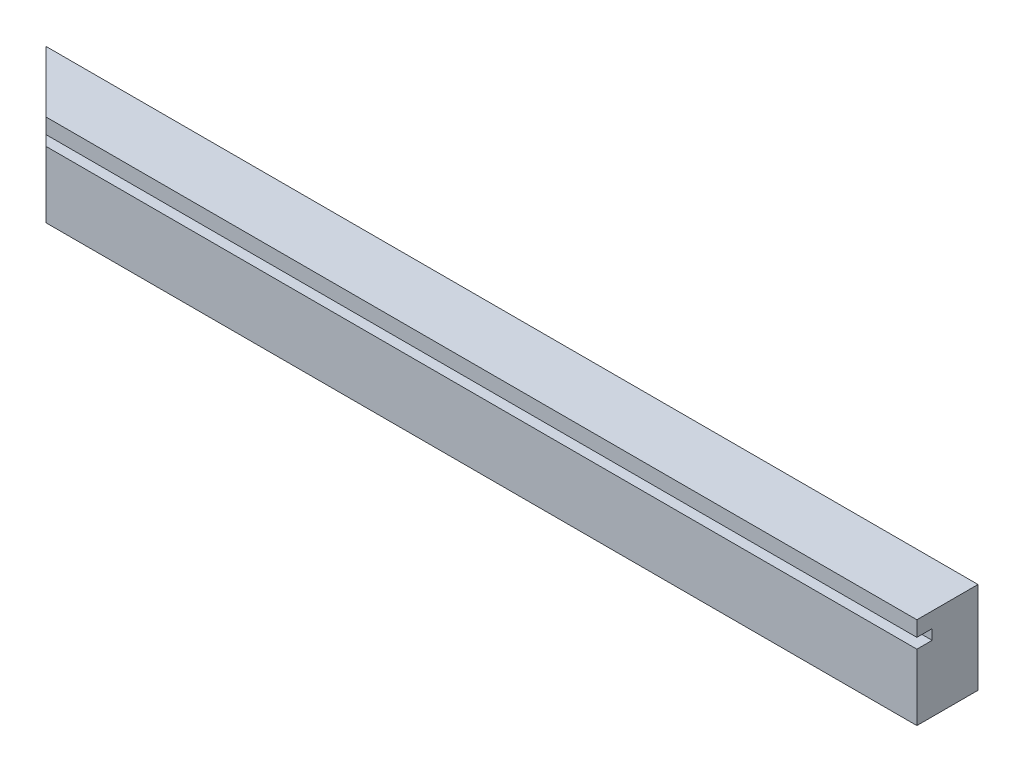
ISO-10303-21;
HEADER;
FILE_DESCRIPTION(('STEP AP214'),'2;1');
FILE_NAME('part.step','',(''),(''),'','','');
FILE_SCHEMA(('AUTOMOTIVE_DESIGN { 1 0 10303 214 1 1 1 1 }'));
ENDSEC;
DATA;
#1=APPLICATION_CONTEXT('core data for automotive mechanical design processes');
#2=APPLICATION_PROTOCOL_DEFINITION('international standard','automotive_design',2000,#1);
#3=PRODUCT_CONTEXT('',#1,'mechanical');
#4=PRODUCT('Part','Part','',(#3));
#5=PRODUCT_RELATED_PRODUCT_CATEGORY('part','',(#4));
#6=PRODUCT_DEFINITION_FORMATION('','',#4);
#7=PRODUCT_DEFINITION_CONTEXT('part definition',#1,'design');
#8=PRODUCT_DEFINITION('design','',#6,#7);
#9=PRODUCT_DEFINITION_SHAPE('','',#8);
#10=(LENGTH_UNIT() NAMED_UNIT(*) SI_UNIT(.MILLI.,.METRE.));
#11=(NAMED_UNIT(*) PLANE_ANGLE_UNIT() SI_UNIT($,.RADIAN.));
#12=(NAMED_UNIT(*) SI_UNIT($,.STERADIAN.) SOLID_ANGLE_UNIT());
#13=UNCERTAINTY_MEASURE_WITH_UNIT(LENGTH_MEASURE(1.E-05),#10,'distance_accuracy_value','');
#14=(GEOMETRIC_REPRESENTATION_CONTEXT(3) GLOBAL_UNCERTAINTY_ASSIGNED_CONTEXT((#13)) GLOBAL_UNIT_ASSIGNED_CONTEXT((#10,
#11,#12)) REPRESENTATION_CONTEXT('',''));
#15=CARTESIAN_POINT('',(0.,0.,0.));
#16=DIRECTION('',(0.,0.,1.));
#17=DIRECTION('',(1.,0.,0.));
#18=AXIS2_PLACEMENT_3D('',#15,#16,#17);
#19=CARTESIAN_POINT('',(183.,18.,4.23272528138341E-13));
#20=DIRECTION('',(1.,0.,0.));
#21=DIRECTION('',(0.,0.,-1.));
#22=AXIS2_PLACEMENT_3D('',#19,#20,#21);
#23=PLANE('',#22);
#24=DIRECTION('',(0.,0.,1.));
#25=VECTOR('',#24,1.);
#26=CARTESIAN_POINT('',(183.,18.,4.23272528138341E-13));
#27=LINE('',#26,#25);
#28=CARTESIAN_POINT('',(183.,18.,-24.));
#29=VERTEX_POINT('',#28);
#30=CARTESIAN_POINT('',(183.,18.,-12.));
#31=VERTEX_POINT('',#30);
#32=EDGE_CURVE('E121',#29,#31,#27,.T.);
#33=ORIENTED_EDGE('',*,*,#32,.T.);
#34=DIRECTION('',(0.,1.,0.));
#35=VECTOR('',#34,1.);
#36=CARTESIAN_POINT('',(183.,0.,-12.));
#37=LINE('',#36,#35);
#38=CARTESIAN_POINT('',(183.,15.,-12.));
#39=VERTEX_POINT('',#38);
#40=EDGE_CURVE('E107',#39,#31,#37,.T.);
#41=ORIENTED_EDGE('',*,*,#40,.F.);
#42=DIRECTION('',(0.,0.,-1.));
#43=VECTOR('',#42,1.);
#44=CARTESIAN_POINT('',(183.,15.,4.23272528138341E-13));
#45=LINE('',#44,#43);
#46=CARTESIAN_POINT('',(183.,15.,-15.));
#47=VERTEX_POINT('',#46);
#48=EDGE_CURVE('E123',#39,#47,#45,.T.);
#49=ORIENTED_EDGE('',*,*,#48,.T.);
#50=DIRECTION('',(0.,1.,0.));
#51=VECTOR('',#50,1.);
#52=CARTESIAN_POINT('',(183.,18.,-15.));
#53=LINE('',#52,#51);
#54=CARTESIAN_POINT('',(183.,13.,-15.));
#55=VERTEX_POINT('',#54);
#56=EDGE_CURVE('E146',#55,#47,#53,.T.);
#57=ORIENTED_EDGE('',*,*,#56,.F.);
#58=DIRECTION('',(0.,0.,1.));
#59=VECTOR('',#58,1.);
#60=CARTESIAN_POINT('',(183.,13.,4.23272528138341E-13));
#61=LINE('',#60,#59);
#62=CARTESIAN_POINT('',(183.,13.,-12.));
#63=VERTEX_POINT('',#62);
#64=EDGE_CURVE('E116',#55,#63,#61,.T.);
#65=ORIENTED_EDGE('',*,*,#64,.T.);
#66=CARTESIAN_POINT('',(183.,0.,-12.));
#67=VERTEX_POINT('',#66);
#68=EDGE_CURVE('E102',#67,#63,#37,.T.);
#69=ORIENTED_EDGE('',*,*,#68,.F.);
#70=DIRECTION('',(0.,0.,1.));
#71=VECTOR('',#70,1.);
#72=CARTESIAN_POINT('',(183.,0.,4.23272528138341E-13));
#73=LINE('',#72,#71);
#74=CARTESIAN_POINT('',(183.,0.,-24.));
#75=VERTEX_POINT('',#74);
#76=EDGE_CURVE('E113',#75,#67,#73,.T.);
#77=ORIENTED_EDGE('',*,*,#76,.F.);
#78=DIRECTION('',(0.,-1.,0.));
#79=VECTOR('',#78,1.);
#80=CARTESIAN_POINT('',(183.,18.,-24.));
#81=LINE('',#80,#79);
#82=EDGE_CURVE('E136',#29,#75,#81,.T.);
#83=ORIENTED_EDGE('',*,*,#82,.F.);
#84=EDGE_LOOP('',(#33,#41,#49,#57,#65,#69,#77,#83));
#85=FACE_BOUND('',#84,.T.);
#86=ADVANCED_FACE('F38',(#85),#23,.T.);
#87=CARTESIAN_POINT('',(0.,18.,0.));
#88=DIRECTION('',(0.,1.,0.));
#89=DIRECTION('',(0.,0.,1.));
#90=AXIS2_PLACEMENT_3D('',#87,#88,#89);
#91=PLANE('',#90);
#92=DIRECTION('',(0.70710678118655,0.,0.707106781186545));
#93=VECTOR('',#92,1.);
#94=CARTESIAN_POINT('',(0.,18.,-24.));
#95=LINE('',#94,#93);
#96=CARTESIAN_POINT('',(0.,18.,-24.));
#97=VERTEX_POINT('',#96);
#98=CARTESIAN_POINT('',(12.0000000000001,18.,-12.));
#99=VERTEX_POINT('',#98);
#100=EDGE_CURVE('E141',#97,#99,#95,.T.);
#101=ORIENTED_EDGE('',*,*,#100,.T.);
#102=DIRECTION('',(-1.,0.,0.));
#103=VECTOR('',#102,1.);
#104=CARTESIAN_POINT('',(183.,18.,-12.));
#105=LINE('',#104,#103);
#106=EDGE_CURVE('E51',#31,#99,#105,.T.);
#107=ORIENTED_EDGE('',*,*,#106,.F.);
#108=ORIENTED_EDGE('',*,*,#32,.F.);
#109=DIRECTION('',(-1.,0.,0.));
#110=VECTOR('',#109,1.);
#111=CARTESIAN_POINT('',(0.,18.,-24.));
#112=LINE('',#111,#110);
#113=EDGE_CURVE('E144',#29,#97,#112,.T.);
#114=ORIENTED_EDGE('',*,*,#113,.T.);
#115=EDGE_LOOP('',(#101,#107,#108,#114));
#116=FACE_BOUND('',#115,.T.);
#117=ADVANCED_FACE('F176',(#116),#91,.T.);
#118=CARTESIAN_POINT('',(0.,0.,0.));
#119=DIRECTION('',(0.,1.,0.));
#120=DIRECTION('',(0.,0.,1.));
#121=AXIS2_PLACEMENT_3D('',#118,#119,#120);
#122=PLANE('',#121);
#123=DIRECTION('',(1.,0.,0.));
#124=VECTOR('',#123,1.);
#125=CARTESIAN_POINT('',(0.,0.,-12.));
#126=LINE('',#125,#124);
#127=CARTESIAN_POINT('',(12.0000000000001,0.,-12.));
#128=VERTEX_POINT('',#127);
#129=EDGE_CURVE('E99',#128,#67,#126,.T.);
#130=ORIENTED_EDGE('',*,*,#129,.F.);
#131=DIRECTION('',(0.70710678118655,0.,0.707106781186545));
#132=VECTOR('',#131,1.);
#133=CARTESIAN_POINT('',(0.,0.,-24.));
#134=LINE('',#133,#132);
#135=CARTESIAN_POINT('',(0.,0.,-24.));
#136=VERTEX_POINT('',#135);
#137=EDGE_CURVE('E142',#136,#128,#134,.T.);
#138=ORIENTED_EDGE('',*,*,#137,.F.);
#139=DIRECTION('',(-1.,0.,0.));
#140=VECTOR('',#139,1.);
#141=CARTESIAN_POINT('',(0.,0.,-24.));
#142=LINE('',#141,#140);
#143=EDGE_CURVE('E119',#75,#136,#142,.T.);
#144=ORIENTED_EDGE('',*,*,#143,.F.);
#145=ORIENTED_EDGE('',*,*,#76,.T.);
#146=EDGE_LOOP('',(#130,#138,#144,#145));
#147=FACE_BOUND('',#146,.T.);
#148=ADVANCED_FACE('F118',(#147),#122,.F.);
#149=CARTESIAN_POINT('',(413.342815169043,13.,-11.9999999999995));
#150=DIRECTION('',(0.,1.,0.));
#151=DIRECTION('',(0.,0.,1.));
#152=AXIS2_PLACEMENT_3D('',#149,#150,#151);
#153=PLANE('',#152);
#154=DIRECTION('',(0.70710678118655,0.,0.707106781186545));
#155=VECTOR('',#154,1.);
#156=CARTESIAN_POINT('',(0.,13.,-24.));
#157=LINE('',#156,#155);
#158=CARTESIAN_POINT('',(9.00000000000056,13.,-14.9999999999996));
#159=VERTEX_POINT('',#158);
#160=CARTESIAN_POINT('',(12.0000000000003,13.,-12.0000000000003));
#161=VERTEX_POINT('',#160);
#162=EDGE_CURVE('E127',#159,#161,#157,.T.);
#163=ORIENTED_EDGE('',*,*,#162,.T.);
#164=DIRECTION('',(1.,0.,0.));
#165=VECTOR('',#164,1.);
#166=CARTESIAN_POINT('',(413.342815169043,13.,-12.));
#167=LINE('',#166,#165);
#168=EDGE_CURVE('E59',#161,#63,#167,.T.);
#169=ORIENTED_EDGE('',*,*,#168,.T.);
#170=ORIENTED_EDGE('',*,*,#64,.F.);
#171=DIRECTION('',(-1.,0.,0.));
#172=VECTOR('',#171,1.);
#173=CARTESIAN_POINT('',(413.342815169043,13.,-15.0000000000005));
#174=LINE('',#173,#172);
#175=EDGE_CURVE('E151',#55,#159,#174,.T.);
#176=ORIENTED_EDGE('',*,*,#175,.T.);
#177=EDGE_LOOP('',(#163,#169,#170,#176));
#178=FACE_BOUND('',#177,.T.);
#179=ADVANCED_FACE('F198',(#178),#153,.T.);
#180=CARTESIAN_POINT('',(413.342815169043,15.,-11.9999999999995));
#181=DIRECTION('',(0.,-1.,0.));
#182=DIRECTION('',(0.,0.,-1.));
#183=AXIS2_PLACEMENT_3D('',#180,#181,#182);
#184=PLANE('',#183);
#185=ORIENTED_EDGE('',*,*,#48,.F.);
#186=DIRECTION('',(-1.,0.,0.));
#187=VECTOR('',#186,1.);
#188=CARTESIAN_POINT('',(413.342815169043,15.,-12.));
#189=LINE('',#188,#187);
#190=CARTESIAN_POINT('',(12.0000000000001,15.,-12.));
#191=VERTEX_POINT('',#190);
#192=EDGE_CURVE('E156',#39,#191,#189,.T.);
#193=ORIENTED_EDGE('',*,*,#192,.T.);
#194=DIRECTION('',(-0.70710678118655,0.,-0.707106781186545));
#195=VECTOR('',#194,1.);
#196=CARTESIAN_POINT('',(0.,15.,-24.));
#197=LINE('',#196,#195);
#198=CARTESIAN_POINT('',(8.99999999999954,15.,-15.0000000000005));
#199=VERTEX_POINT('',#198);
#200=EDGE_CURVE('E133',#191,#199,#197,.T.);
#201=ORIENTED_EDGE('',*,*,#200,.T.);
#202=DIRECTION('',(-1.,0.,0.));
#203=VECTOR('',#202,1.);
#204=CARTESIAN_POINT('',(413.342815169043,15.,-15.0000000000005));
#205=LINE('',#204,#203);
#206=EDGE_CURVE('E153',#47,#199,#205,.T.);
#207=ORIENTED_EDGE('',*,*,#206,.F.);
#208=EDGE_LOOP('',(#185,#193,#201,#207));
#209=FACE_BOUND('',#208,.T.);
#210=ADVANCED_FACE('F162',(#209),#184,.T.);
#211=CARTESIAN_POINT('',(0.,18.,-24.));
#212=DIRECTION('',(-0.707106781186545,0.,0.70710678118655));
#213=DIRECTION('',(-0.70710678118655,0.,-0.707106781186545));
#214=AXIS2_PLACEMENT_3D('',#211,#212,#213);
#215=PLANE('',#214);
#216=DIRECTION('',(0.,-1.,0.));
#217=VECTOR('',#216,1.);
#218=CARTESIAN_POINT('',(9.00000000000047,18.,-14.9999999999996));
#219=LINE('',#218,#217);
#220=EDGE_CURVE('E130',#199,#159,#219,.T.);
#221=ORIENTED_EDGE('',*,*,#220,.F.);
#222=ORIENTED_EDGE('',*,*,#200,.F.);
#223=DIRECTION('',(0.,-1.,0.));
#224=VECTOR('',#223,1.);
#225=CARTESIAN_POINT('',(12.0000000000001,18.,-12.));
#226=LINE('',#225,#224);
#227=EDGE_CURVE('E11',#99,#191,#226,.T.);
#228=ORIENTED_EDGE('',*,*,#227,.F.);
#229=ORIENTED_EDGE('',*,*,#100,.F.);
#230=DIRECTION('',(0.,-1.,0.));
#231=VECTOR('',#230,1.);
#232=CARTESIAN_POINT('',(0.,18.,-24.));
#233=LINE('',#232,#231);
#234=EDGE_CURVE('E138',#97,#136,#233,.T.);
#235=ORIENTED_EDGE('',*,*,#234,.T.);
#236=ORIENTED_EDGE('',*,*,#137,.T.);
#237=EDGE_CURVE('E45',#161,#128,#226,.T.);
#238=ORIENTED_EDGE('',*,*,#237,.F.);
#239=ORIENTED_EDGE('',*,*,#162,.F.);
#240=EDGE_LOOP('',(#221,#222,#228,#229,#235,#236,#238,#239));
#241=FACE_BOUND('',#240,.T.);
#242=ADVANCED_FACE('F168',(#241),#215,.T.);
#243=CARTESIAN_POINT('',(0.,18.,-24.));
#244=DIRECTION('',(0.,0.,-1.));
#245=DIRECTION('',(1.,0.,0.));
#246=AXIS2_PLACEMENT_3D('',#243,#244,#245);
#247=PLANE('',#246);
#248=ORIENTED_EDGE('',*,*,#143,.T.);
#249=ORIENTED_EDGE('',*,*,#234,.F.);
#250=ORIENTED_EDGE('',*,*,#113,.F.);
#251=ORIENTED_EDGE('',*,*,#82,.T.);
#252=EDGE_LOOP('',(#248,#249,#250,#251));
#253=FACE_BOUND('',#252,.T.);
#254=ADVANCED_FACE('F180',(#253),#247,.T.);
#255=CARTESIAN_POINT('',(413.342815169043,15.,-15.0000000000005));
#256=DIRECTION('',(0.,0.,1.));
#257=DIRECTION('',(-1.,0.,0.));
#258=AXIS2_PLACEMENT_3D('',#255,#256,#257);
#259=PLANE('',#258);
#260=ORIENTED_EDGE('',*,*,#56,.T.);
#261=ORIENTED_EDGE('',*,*,#206,.T.);
#262=ORIENTED_EDGE('',*,*,#220,.T.);
#263=ORIENTED_EDGE('',*,*,#175,.F.);
#264=EDGE_LOOP('',(#260,#261,#262,#263));
#265=FACE_BOUND('',#264,.T.);
#266=ADVANCED_FACE('F173',(#265),#259,.T.);
#267=CARTESIAN_POINT('',(0.,0.,-12.));
#268=DIRECTION('',(0.,0.,1.));
#269=DIRECTION('',(1.,0.,0.));
#270=AXIS2_PLACEMENT_3D('',#267,#268,#269);
#271=PLANE('',#270);
#272=ORIENTED_EDGE('',*,*,#40,.T.);
#273=ORIENTED_EDGE('',*,*,#106,.T.);
#274=ORIENTED_EDGE('',*,*,#227,.T.);
#275=ORIENTED_EDGE('',*,*,#192,.F.);
#276=EDGE_LOOP('',(#272,#273,#274,#275));
#277=FACE_BOUND('',#276,.T.);
#278=ADVANCED_FACE('F174',(#277),#271,.T.);
#279=ORIENTED_EDGE('',*,*,#237,.T.);
#280=ORIENTED_EDGE('',*,*,#129,.T.);
#281=ORIENTED_EDGE('',*,*,#68,.T.);
#282=ORIENTED_EDGE('',*,*,#168,.F.);
#283=EDGE_LOOP('',(#279,#280,#281,#282));
#284=FACE_BOUND('',#283,.T.);
#285=ADVANCED_FACE('F101',(#284),#271,.T.);
#286=CLOSED_SHELL('',(#86,#117,#148,#179,#210,#242,#254,#266,#278,#285));
#287=MANIFOLD_SOLID_BREP('B2',#286);
#288=ADVANCED_BREP_SHAPE_REPRESENTATION('',(#18,#287),#14);
#289=SHAPE_DEFINITION_REPRESENTATION(#9,#288);
ENDSEC;
END-ISO-10303-21;
